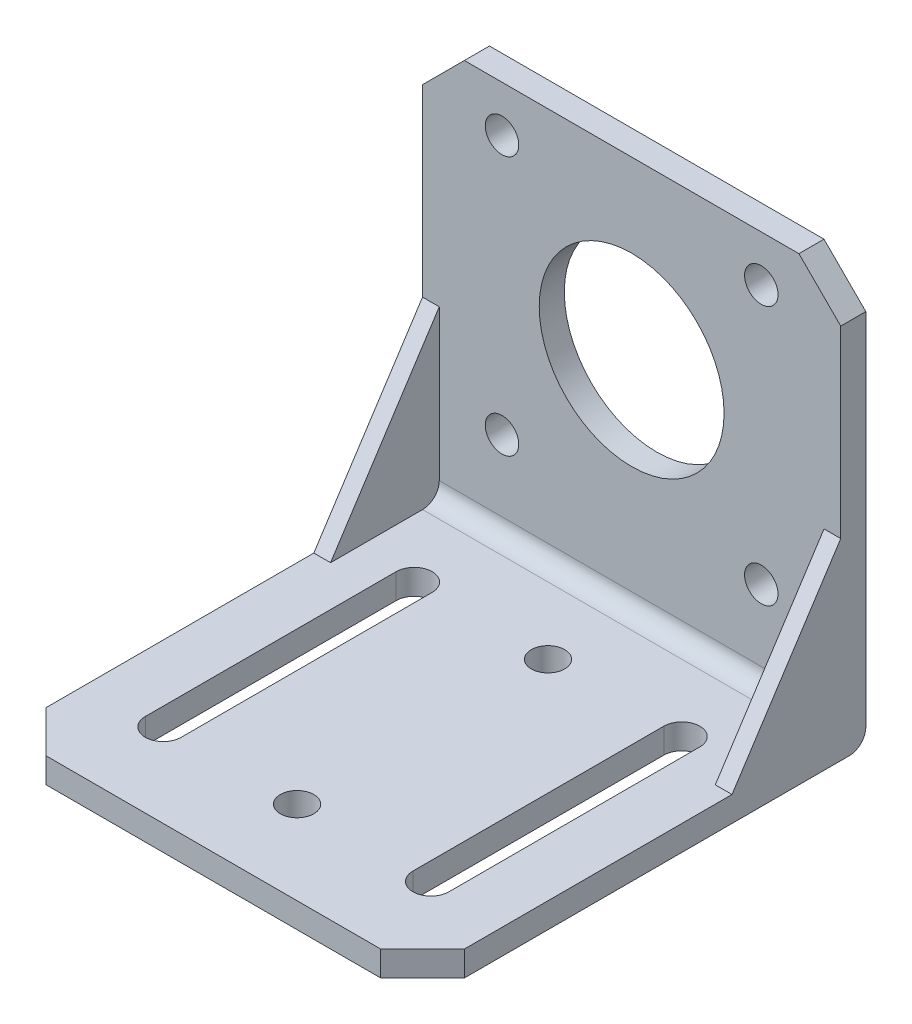
ISO-10303-21;
HEADER;
FILE_DESCRIPTION(('STEP AP214'),'2;1');
FILE_NAME('part.step','',(''),(''),'','','');
FILE_SCHEMA(('AUTOMOTIVE_DESIGN { 1 0 10303 214 1 1 1 1 }'));
ENDSEC;
DATA;
#1=APPLICATION_CONTEXT('core data for automotive mechanical design processes');
#2=APPLICATION_PROTOCOL_DEFINITION('international standard','automotive_design',2000,#1);
#3=PRODUCT_CONTEXT('',#1,'mechanical');
#4=PRODUCT('Part','Part','',(#3));
#5=PRODUCT_RELATED_PRODUCT_CATEGORY('part','',(#4));
#6=PRODUCT_DEFINITION_FORMATION('','',#4);
#7=PRODUCT_DEFINITION_CONTEXT('part definition',#1,'design');
#8=PRODUCT_DEFINITION('design','',#6,#7);
#9=PRODUCT_DEFINITION_SHAPE('','',#8);
#10=(LENGTH_UNIT() NAMED_UNIT(*) SI_UNIT(.MILLI.,.METRE.));
#11=(NAMED_UNIT(*) PLANE_ANGLE_UNIT() SI_UNIT($,.RADIAN.));
#12=(NAMED_UNIT(*) SI_UNIT($,.STERADIAN.) SOLID_ANGLE_UNIT());
#13=UNCERTAINTY_MEASURE_WITH_UNIT(LENGTH_MEASURE(1.E-05),#10,'distance_accuracy_value','');
#14=(GEOMETRIC_REPRESENTATION_CONTEXT(3) GLOBAL_UNCERTAINTY_ASSIGNED_CONTEXT((#13)) GLOBAL_UNIT_ASSIGNED_CONTEXT((#10,
#11,#12)) REPRESENTATION_CONTEXT('',''));
#15=CARTESIAN_POINT('',(0.,0.,0.));
#16=DIRECTION('',(0.,0.,1.));
#17=DIRECTION('',(1.,0.,0.));
#18=AXIS2_PLACEMENT_3D('',#15,#16,#17);
#19=CARTESIAN_POINT('',(25.,50.,0.));
#20=DIRECTION('',(0.,0.,1.));
#21=DIRECTION('',(0.,-1.,0.));
#22=AXIS2_PLACEMENT_3D('',#19,#20,#21);
#23=PLANE('',#22);
#24=CARTESIAN_POINT('',(15.5,13.5,0.));
#25=DIRECTION('',(0.,0.,1.));
#26=DIRECTION('',(1.,0.,0.));
#27=AXIS2_PLACEMENT_3D('',#24,#25,#26);
#28=CIRCLE('',#27,2.);
#29=CARTESIAN_POINT('',(17.5,13.5,0.));
#30=VERTEX_POINT('',#29);
#31=EDGE_CURVE('E296',#30,#30,#28,.T.);
#32=ORIENTED_EDGE('',*,*,#31,.T.);
#33=EDGE_LOOP('',(#32));
#34=FACE_BOUND('',#33,.T.);
#35=CARTESIAN_POINT('',(-15.5,13.5,0.));
#36=DIRECTION('',(0.,0.,1.));
#37=DIRECTION('',(-1.,0.,0.));
#38=AXIS2_PLACEMENT_3D('',#35,#36,#37);
#39=CIRCLE('',#38,2.);
#40=CARTESIAN_POINT('',(-17.5,13.5,0.));
#41=VERTEX_POINT('',#40);
#42=EDGE_CURVE('E290',#41,#41,#39,.T.);
#43=ORIENTED_EDGE('',*,*,#42,.T.);
#44=EDGE_LOOP('',(#43));
#45=FACE_BOUND('',#44,.T.);
#46=CARTESIAN_POINT('',(15.5,44.5,0.));
#47=DIRECTION('',(0.,0.,1.));
#48=DIRECTION('',(-1.,0.,0.));
#49=AXIS2_PLACEMENT_3D('',#46,#47,#48);
#50=CIRCLE('',#49,2.);
#51=CARTESIAN_POINT('',(13.5,44.5,0.));
#52=VERTEX_POINT('',#51);
#53=EDGE_CURVE('E284',#52,#52,#50,.T.);
#54=ORIENTED_EDGE('',*,*,#53,.T.);
#55=EDGE_LOOP('',(#54));
#56=FACE_BOUND('',#55,.T.);
#57=CARTESIAN_POINT('',(-15.5,44.5,0.));
#58=DIRECTION('',(0.,0.,1.));
#59=DIRECTION('',(1.,0.,0.));
#60=AXIS2_PLACEMENT_3D('',#57,#58,#59);
#61=CIRCLE('',#60,2.);
#62=CARTESIAN_POINT('',(-13.5,44.5,0.));
#63=VERTEX_POINT('',#62);
#64=EDGE_CURVE('E277',#63,#63,#61,.T.);
#65=ORIENTED_EDGE('',*,*,#64,.T.);
#66=EDGE_LOOP('',(#65));
#67=FACE_BOUND('',#66,.T.);
#68=CARTESIAN_POINT('',(0.,29.,0.));
#69=DIRECTION('',(0.,0.,1.));
#70=DIRECTION('',(1.,0.,0.));
#71=AXIS2_PLACEMENT_3D('',#68,#69,#70);
#72=CIRCLE('',#71,11.05);
#73=CARTESIAN_POINT('',(11.05,29.,0.));
#74=VERTEX_POINT('',#73);
#75=EDGE_CURVE('E301',#74,#74,#72,.T.);
#76=ORIENTED_EDGE('',*,*,#75,.T.);
#77=EDGE_LOOP('',(#76));
#78=FACE_BOUND('',#77,.T.);
#79=DIRECTION('',(0.,1.,0.));
#80=VECTOR('',#79,1.);
#81=CARTESIAN_POINT('',(-25.,50.,0.));
#82=LINE('',#81,#80);
#83=CARTESIAN_POINT('',(-25.,2.,0.));
#84=VERTEX_POINT('',#83);
#85=CARTESIAN_POINT('',(-25.,45.,0.));
#86=VERTEX_POINT('',#85);
#87=EDGE_CURVE('E339',#84,#86,#82,.T.);
#88=ORIENTED_EDGE('',*,*,#87,.T.);
#89=DIRECTION('',(0.707106781186546,0.707106781186549,0.));
#90=VECTOR('',#89,1.);
#91=CARTESIAN_POINT('',(-20.,50.,0.));
#92=LINE('',#91,#90);
#93=CARTESIAN_POINT('',(-20.,50.,0.));
#94=VERTEX_POINT('',#93);
#95=EDGE_CURVE('E11',#86,#94,#92,.T.);
#96=ORIENTED_EDGE('',*,*,#95,.T.);
#97=DIRECTION('',(-1.,0.,0.));
#98=VECTOR('',#97,1.);
#99=CARTESIAN_POINT('',(25.,50.,0.));
#100=LINE('',#99,#98);
#101=CARTESIAN_POINT('',(20.,50.,0.));
#102=VERTEX_POINT('',#101);
#103=EDGE_CURVE('E368',#102,#94,#100,.T.);
#104=ORIENTED_EDGE('',*,*,#103,.F.);
#105=DIRECTION('',(-0.70710678118655,0.707106781186545,0.));
#106=VECTOR('',#105,1.);
#107=CARTESIAN_POINT('',(25.,45.,0.));
#108=LINE('',#107,#106);
#109=CARTESIAN_POINT('',(25.,45.,0.));
#110=VERTEX_POINT('',#109);
#111=EDGE_CURVE('E51',#102,#110,#108,.F.);
#112=ORIENTED_EDGE('',*,*,#111,.T.);
#113=DIRECTION('',(0.,1.,0.));
#114=VECTOR('',#113,1.);
#115=CARTESIAN_POINT('',(25.,50.,0.));
#116=LINE('',#115,#114);
#117=CARTESIAN_POINT('',(25.,2.,0.));
#118=VERTEX_POINT('',#117);
#119=EDGE_CURVE('E340',#118,#110,#116,.T.);
#120=ORIENTED_EDGE('',*,*,#119,.F.);
#121=DIRECTION('',(-1.,0.,0.));
#122=VECTOR('',#121,1.);
#123=CARTESIAN_POINT('',(25.,2.,0.));
#124=LINE('',#123,#122);
#125=EDGE_CURVE('E380',#118,#84,#124,.T.);
#126=ORIENTED_EDGE('',*,*,#125,.T.);
#127=EDGE_LOOP('',(#88,#96,#104,#112,#120,#126));
#128=FACE_BOUND('',#127,.T.);
#129=ADVANCED_FACE('F42',(#34,#45,#56,#67,#78,#128),#23,.F.);
#130=CARTESIAN_POINT('',(25.,50.,3.));
#131=DIRECTION('',(0.,-1.,0.));
#132=DIRECTION('',(0.,0.,-1.));
#133=AXIS2_PLACEMENT_3D('',#130,#131,#132);
#134=PLANE('',#133);
#135=ORIENTED_EDGE('',*,*,#103,.T.);
#136=DIRECTION('',(0.,0.,1.));
#137=VECTOR('',#136,1.);
#138=CARTESIAN_POINT('',(-20.,50.,3.));
#139=LINE('',#138,#137);
#140=CARTESIAN_POINT('',(-20.,50.,3.));
#141=VERTEX_POINT('',#140);
#142=EDGE_CURVE('E416',#94,#141,#139,.T.);
#143=ORIENTED_EDGE('',*,*,#142,.T.);
#144=DIRECTION('',(-1.,0.,0.));
#145=VECTOR('',#144,1.);
#146=CARTESIAN_POINT('',(25.,50.,3.));
#147=LINE('',#146,#145);
#148=CARTESIAN_POINT('',(20.,50.,3.));
#149=VERTEX_POINT('',#148);
#150=EDGE_CURVE('E365',#149,#141,#147,.T.);
#151=ORIENTED_EDGE('',*,*,#150,.F.);
#152=DIRECTION('',(0.,0.,-1.));
#153=VECTOR('',#152,1.);
#154=CARTESIAN_POINT('',(20.,50.,3.));
#155=LINE('',#154,#153);
#156=EDGE_CURVE('E414',#149,#102,#155,.T.);
#157=ORIENTED_EDGE('',*,*,#156,.T.);
#158=EDGE_LOOP('',(#135,#143,#151,#157));
#159=FACE_BOUND('',#158,.T.);
#160=ADVANCED_FACE('F438',(#159),#134,.F.);
#161=CARTESIAN_POINT('',(25.,2.99999999999999,3.));
#162=DIRECTION('',(0.,0.,-1.));
#163=DIRECTION('',(0.,1.,0.));
#164=AXIS2_PLACEMENT_3D('',#161,#162,#163);
#165=PLANE('',#164);
#166=CARTESIAN_POINT('',(15.5,13.5,3.));
#167=DIRECTION('',(0.,0.,1.));
#168=DIRECTION('',(1.,0.,0.));
#169=AXIS2_PLACEMENT_3D('',#166,#167,#168);
#170=CIRCLE('',#169,2.);
#171=CARTESIAN_POINT('',(17.5,13.5,3.));
#172=VERTEX_POINT('',#171);
#173=EDGE_CURVE('E243',#172,#172,#170,.T.);
#174=ORIENTED_EDGE('',*,*,#173,.F.);
#175=EDGE_LOOP('',(#174));
#176=FACE_BOUND('',#175,.T.);
#177=CARTESIAN_POINT('',(-15.5,13.5,3.));
#178=DIRECTION('',(0.,0.,1.));
#179=DIRECTION('',(-1.,0.,0.));
#180=AXIS2_PLACEMENT_3D('',#177,#178,#179);
#181=CIRCLE('',#180,2.);
#182=CARTESIAN_POINT('',(-17.5,13.5,3.));
#183=VERTEX_POINT('',#182);
#184=EDGE_CURVE('E293',#183,#183,#181,.T.);
#185=ORIENTED_EDGE('',*,*,#184,.F.);
#186=EDGE_LOOP('',(#185));
#187=FACE_BOUND('',#186,.T.);
#188=CARTESIAN_POINT('',(15.5,44.5,3.));
#189=DIRECTION('',(0.,0.,1.));
#190=DIRECTION('',(-1.,0.,0.));
#191=AXIS2_PLACEMENT_3D('',#188,#189,#190);
#192=CIRCLE('',#191,2.);
#193=CARTESIAN_POINT('',(13.5,44.5,3.));
#194=VERTEX_POINT('',#193);
#195=EDGE_CURVE('E287',#194,#194,#192,.T.);
#196=ORIENTED_EDGE('',*,*,#195,.F.);
#197=EDGE_LOOP('',(#196));
#198=FACE_BOUND('',#197,.T.);
#199=CARTESIAN_POINT('',(-15.5,44.5,3.));
#200=DIRECTION('',(0.,0.,1.));
#201=DIRECTION('',(1.,0.,0.));
#202=AXIS2_PLACEMENT_3D('',#199,#200,#201);
#203=CIRCLE('',#202,2.);
#204=CARTESIAN_POINT('',(-13.5,44.5,3.));
#205=VERTEX_POINT('',#204);
#206=EDGE_CURVE('E281',#205,#205,#203,.T.);
#207=ORIENTED_EDGE('',*,*,#206,.F.);
#208=EDGE_LOOP('',(#207));
#209=FACE_BOUND('',#208,.T.);
#210=CARTESIAN_POINT('',(0.,29.,3.));
#211=DIRECTION('',(0.,0.,1.));
#212=DIRECTION('',(1.,0.,0.));
#213=AXIS2_PLACEMENT_3D('',#210,#211,#212);
#214=CIRCLE('',#213,11.05);
#215=CARTESIAN_POINT('',(11.05,29.,3.));
#216=VERTEX_POINT('',#215);
#217=EDGE_CURVE('E280',#216,#216,#214,.T.);
#218=ORIENTED_EDGE('',*,*,#217,.F.);
#219=EDGE_LOOP('',(#218));
#220=FACE_BOUND('',#219,.T.);
#221=ORIENTED_EDGE('',*,*,#150,.T.);
#222=DIRECTION('',(-0.707106781186546,-0.707106781186549,0.));
#223=VECTOR('',#222,1.);
#224=CARTESIAN_POINT('',(-20.,50.,3.));
#225=LINE('',#224,#223);
#226=CARTESIAN_POINT('',(-25.,45.,3.));
#227=VERTEX_POINT('',#226);
#228=EDGE_CURVE('E421',#141,#227,#225,.T.);
#229=ORIENTED_EDGE('',*,*,#228,.T.);
#230=DIRECTION('',(0.,-1.,0.));
#231=VECTOR('',#230,1.);
#232=CARTESIAN_POINT('',(-25.,2.99999999999999,3.));
#233=LINE('',#232,#231);
#234=CARTESIAN_POINT('',(-25.,23.,3.));
#235=VERTEX_POINT('',#234);
#236=EDGE_CURVE('E354',#227,#235,#233,.T.);
#237=ORIENTED_EDGE('',*,*,#236,.T.);
#238=DIRECTION('',(1.,0.,0.));
#239=VECTOR('',#238,1.);
#240=CARTESIAN_POINT('',(25.,23.,3.));
#241=LINE('',#240,#239);
#242=CARTESIAN_POINT('',(-23.,23.,3.));
#243=VERTEX_POINT('',#242);
#244=EDGE_CURVE('E314',#235,#243,#241,.T.);
#245=ORIENTED_EDGE('',*,*,#244,.T.);
#246=DIRECTION('',(0.,1.,0.));
#247=VECTOR('',#246,1.);
#248=CARTESIAN_POINT('',(-23.,2.99999999999999,3.));
#249=LINE('',#248,#247);
#250=CARTESIAN_POINT('',(-23.,4.99999999999999,3.));
#251=VERTEX_POINT('',#250);
#252=EDGE_CURVE('E320',#251,#243,#249,.T.);
#253=ORIENTED_EDGE('',*,*,#252,.F.);
#254=DIRECTION('',(-1.,0.,0.));
#255=VECTOR('',#254,1.);
#256=CARTESIAN_POINT('',(23.,4.99999999999999,3.));
#257=LINE('',#256,#255);
#258=CARTESIAN_POINT('',(23.,4.99999999999999,3.));
#259=VERTEX_POINT('',#258);
#260=EDGE_CURVE('E376',#251,#259,#257,.F.);
#261=ORIENTED_EDGE('',*,*,#260,.T.);
#262=DIRECTION('',(0.,-1.,0.));
#263=VECTOR('',#262,1.);
#264=CARTESIAN_POINT('',(23.,2.99999999999999,3.));
#265=LINE('',#264,#263);
#266=CARTESIAN_POINT('',(23.,23.,3.));
#267=VERTEX_POINT('',#266);
#268=EDGE_CURVE('E336',#267,#259,#265,.T.);
#269=ORIENTED_EDGE('',*,*,#268,.F.);
#270=DIRECTION('',(-1.,0.,0.));
#271=VECTOR('',#270,1.);
#272=CARTESIAN_POINT('',(25.,23.,3.));
#273=LINE('',#272,#271);
#274=CARTESIAN_POINT('',(25.,23.,3.));
#275=VERTEX_POINT('',#274);
#276=EDGE_CURVE('E331',#267,#275,#273,.F.);
#277=ORIENTED_EDGE('',*,*,#276,.T.);
#278=DIRECTION('',(0.,-1.,0.));
#279=VECTOR('',#278,1.);
#280=CARTESIAN_POINT('',(25.,2.99999999999999,3.));
#281=LINE('',#280,#279);
#282=CARTESIAN_POINT('',(25.,45.,3.));
#283=VERTEX_POINT('',#282);
#284=EDGE_CURVE('E343',#283,#275,#281,.T.);
#285=ORIENTED_EDGE('',*,*,#284,.F.);
#286=DIRECTION('',(0.70710678118655,-0.707106781186545,0.));
#287=VECTOR('',#286,1.);
#288=CARTESIAN_POINT('',(25.,45.,3.));
#289=LINE('',#288,#287);
#290=EDGE_CURVE('E419',#283,#149,#289,.F.);
#291=ORIENTED_EDGE('',*,*,#290,.T.);
#292=EDGE_LOOP('',(#221,#229,#237,#245,#253,#261,#269,#277,#285,#291));
#293=FACE_BOUND('',#292,.T.);
#294=ADVANCED_FACE('F436',(#176,#187,#198,#209,#220,#293),#165,.F.);
#295=CARTESIAN_POINT('',(25.,2.99999999999999,53.));
#296=DIRECTION('',(0.,-1.,0.));
#297=DIRECTION('',(0.,0.,-1.));
#298=AXIS2_PLACEMENT_3D('',#295,#296,#297);
#299=PLANE('',#298);
#300=CARTESIAN_POINT('',(0.,2.99999999999999,13.));
#301=DIRECTION('',(0.,1.,0.));
#302=DIRECTION('',(0.,0.,1.));
#303=AXIS2_PLACEMENT_3D('',#300,#301,#302);
#304=CIRCLE('',#303,2.);
#305=CARTESIAN_POINT('',(0.,2.99999999999999,15.));
#306=VERTEX_POINT('',#305);
#307=EDGE_CURVE('E594',#306,#306,#304,.T.);
#308=ORIENTED_EDGE('',*,*,#307,.F.);
#309=EDGE_LOOP('',(#308));
#310=FACE_BOUND('',#309,.T.);
#311=CARTESIAN_POINT('',(0.,2.99999999999999,43.));
#312=DIRECTION('',(0.,1.,0.));
#313=DIRECTION('',(0.,0.,-1.));
#314=AXIS2_PLACEMENT_3D('',#311,#312,#313);
#315=CIRCLE('',#314,2.);
#316=CARTESIAN_POINT('',(0.,2.99999999999999,41.));
#317=VERTEX_POINT('',#316);
#318=EDGE_CURVE('E230',#317,#317,#315,.T.);
#319=ORIENTED_EDGE('',*,*,#318,.F.);
#320=EDGE_LOOP('',(#319));
#321=FACE_BOUND('',#320,.T.);
#322=DIRECTION('',(0.,0.,1.));
#323=VECTOR('',#322,1.);
#324=CARTESIAN_POINT('',(-18.15,2.99999999999999,13.));
#325=LINE('',#324,#323);
#326=CARTESIAN_POINT('',(-18.15,2.99999999999999,13.));
#327=VERTEX_POINT('',#326);
#328=CARTESIAN_POINT('',(-18.15,2.99999999999999,43.));
#329=VERTEX_POINT('',#328);
#330=EDGE_CURVE('E236',#327,#329,#325,.T.);
#331=ORIENTED_EDGE('',*,*,#330,.F.);
#332=CARTESIAN_POINT('',(-16.,2.99999999999999,13.));
#333=DIRECTION('',(0.,1.,0.));
#334=DIRECTION('',(0.,0.,1.));
#335=AXIS2_PLACEMENT_3D('',#332,#333,#334);
#336=CIRCLE('',#335,2.15);
#337=CARTESIAN_POINT('',(-13.85,2.99999999999999,13.));
#338=VERTEX_POINT('',#337);
#339=EDGE_CURVE('E58',#338,#327,#336,.T.);
#340=ORIENTED_EDGE('',*,*,#339,.F.);
#341=DIRECTION('',(0.,0.,-1.));
#342=VECTOR('',#341,1.);
#343=CARTESIAN_POINT('',(-13.85,2.99999999999999,13.));
#344=LINE('',#343,#342);
#345=CARTESIAN_POINT('',(-13.85,2.99999999999999,43.));
#346=VERTEX_POINT('',#345);
#347=EDGE_CURVE('E224',#346,#338,#344,.T.);
#348=ORIENTED_EDGE('',*,*,#347,.F.);
#349=CARTESIAN_POINT('',(-16.,2.99999999999999,43.));
#350=DIRECTION('',(0.,1.,0.));
#351=DIRECTION('',(0.,0.,1.));
#352=AXIS2_PLACEMENT_3D('',#349,#350,#351);
#353=CIRCLE('',#352,2.15);
#354=EDGE_CURVE('E227',#329,#346,#353,.T.);
#355=ORIENTED_EDGE('',*,*,#354,.F.);
#356=EDGE_LOOP('',(#331,#340,#348,#355));
#357=FACE_BOUND('',#356,.T.);
#358=DIRECTION('',(0.,0.,1.));
#359=VECTOR('',#358,1.);
#360=CARTESIAN_POINT('',(13.85,2.99999999999999,13.));
#361=LINE('',#360,#359);
#362=CARTESIAN_POINT('',(13.85,2.99999999999999,13.));
#363=VERTEX_POINT('',#362);
#364=CARTESIAN_POINT('',(13.85,2.99999999999999,43.));
#365=VERTEX_POINT('',#364);
#366=EDGE_CURVE('E262',#363,#365,#361,.T.);
#367=ORIENTED_EDGE('',*,*,#366,.F.);
#368=CARTESIAN_POINT('',(16.,2.99999999999999,13.));
#369=DIRECTION('',(0.,1.,0.));
#370=DIRECTION('',(0.,0.,-1.));
#371=AXIS2_PLACEMENT_3D('',#368,#369,#370);
#372=CIRCLE('',#371,2.15);
#373=CARTESIAN_POINT('',(18.15,2.99999999999999,13.));
#374=VERTEX_POINT('',#373);
#375=EDGE_CURVE('E66',#374,#363,#372,.T.);
#376=ORIENTED_EDGE('',*,*,#375,.F.);
#377=DIRECTION('',(0.,0.,-1.));
#378=VECTOR('',#377,1.);
#379=CARTESIAN_POINT('',(18.15,2.99999999999999,13.));
#380=LINE('',#379,#378);
#381=CARTESIAN_POINT('',(18.15,2.99999999999999,43.));
#382=VERTEX_POINT('',#381);
#383=EDGE_CURVE('E251',#382,#374,#380,.T.);
#384=ORIENTED_EDGE('',*,*,#383,.F.);
#385=CARTESIAN_POINT('',(16.,2.99999999999999,43.));
#386=DIRECTION('',(0.,1.,0.));
#387=DIRECTION('',(0.,0.,-1.));
#388=AXIS2_PLACEMENT_3D('',#385,#386,#387);
#389=CIRCLE('',#388,2.15);
#390=EDGE_CURVE('E266',#365,#382,#389,.T.);
#391=ORIENTED_EDGE('',*,*,#390,.F.);
#392=EDGE_LOOP('',(#367,#376,#384,#391));
#393=FACE_BOUND('',#392,.T.);
#394=DIRECTION('',(-1.,0.,0.));
#395=VECTOR('',#394,1.);
#396=CARTESIAN_POINT('',(25.,2.99999999999999,53.));
#397=LINE('',#396,#395);
#398=CARTESIAN_POINT('',(20.,2.99999999999999,53.));
#399=VERTEX_POINT('',#398);
#400=CARTESIAN_POINT('',(-20.,2.99999999999999,53.));
#401=VERTEX_POINT('',#400);
#402=EDGE_CURVE('E362',#399,#401,#397,.T.);
#403=ORIENTED_EDGE('',*,*,#402,.F.);
#404=DIRECTION('',(-0.70710678118655,0.,0.707106781186545));
#405=VECTOR('',#404,1.);
#406=CARTESIAN_POINT('',(25.,2.99999999999999,48.));
#407=LINE('',#406,#405);
#408=CARTESIAN_POINT('',(25.,2.99999999999999,48.));
#409=VERTEX_POINT('',#408);
#410=EDGE_CURVE('E408',#399,#409,#407,.F.);
#411=ORIENTED_EDGE('',*,*,#410,.T.);
#412=DIRECTION('',(0.,0.,1.));
#413=VECTOR('',#412,1.);
#414=CARTESIAN_POINT('',(25.,2.99999999999999,53.));
#415=LINE('',#414,#413);
#416=CARTESIAN_POINT('',(25.,2.99999999999999,16.));
#417=VERTEX_POINT('',#416);
#418=EDGE_CURVE('E346',#417,#409,#415,.T.);
#419=ORIENTED_EDGE('',*,*,#418,.F.);
#420=DIRECTION('',(1.,0.,0.));
#421=VECTOR('',#420,1.);
#422=CARTESIAN_POINT('',(25.,2.99999999999999,16.));
#423=LINE('',#422,#421);
#424=CARTESIAN_POINT('',(23.,2.99999999999999,16.));
#425=VERTEX_POINT('',#424);
#426=EDGE_CURVE('E326',#417,#425,#423,.F.);
#427=ORIENTED_EDGE('',*,*,#426,.T.);
#428=DIRECTION('',(0.,0.,1.));
#429=VECTOR('',#428,1.);
#430=CARTESIAN_POINT('',(23.,2.99999999999999,53.));
#431=LINE('',#430,#429);
#432=CARTESIAN_POINT('',(23.,2.99999999999999,5.));
#433=VERTEX_POINT('',#432);
#434=EDGE_CURVE('E334',#433,#425,#431,.T.);
#435=ORIENTED_EDGE('',*,*,#434,.F.);
#436=DIRECTION('',(-1.,0.,0.));
#437=VECTOR('',#436,1.);
#438=CARTESIAN_POINT('',(-23.,2.99999999999999,5.));
#439=LINE('',#438,#437);
#440=CARTESIAN_POINT('',(-23.,2.99999999999999,5.));
#441=VERTEX_POINT('',#440);
#442=EDGE_CURVE('E371',#433,#441,#439,.T.);
#443=ORIENTED_EDGE('',*,*,#442,.T.);
#444=DIRECTION('',(0.,0.,-1.));
#445=VECTOR('',#444,1.);
#446=CARTESIAN_POINT('',(-23.,2.99999999999999,53.));
#447=LINE('',#446,#445);
#448=CARTESIAN_POINT('',(-23.,2.99999999999999,16.));
#449=VERTEX_POINT('',#448);
#450=EDGE_CURVE('E317',#449,#441,#447,.T.);
#451=ORIENTED_EDGE('',*,*,#450,.F.);
#452=DIRECTION('',(-1.,0.,0.));
#453=VECTOR('',#452,1.);
#454=CARTESIAN_POINT('',(25.,2.99999999999999,16.));
#455=LINE('',#454,#453);
#456=CARTESIAN_POINT('',(-25.,2.99999999999999,16.));
#457=VERTEX_POINT('',#456);
#458=EDGE_CURVE('E310',#449,#457,#455,.T.);
#459=ORIENTED_EDGE('',*,*,#458,.T.);
#460=DIRECTION('',(0.,0.,1.));
#461=VECTOR('',#460,1.);
#462=CARTESIAN_POINT('',(-25.,2.99999999999999,53.));
#463=LINE('',#462,#461);
#464=CARTESIAN_POINT('',(-25.,2.99999999999999,48.));
#465=VERTEX_POINT('',#464);
#466=EDGE_CURVE('E356',#457,#465,#463,.T.);
#467=ORIENTED_EDGE('',*,*,#466,.T.);
#468=DIRECTION('',(0.707106781186546,0.,0.707106781186549));
#469=VECTOR('',#468,1.);
#470=CARTESIAN_POINT('',(-20.,2.99999999999999,53.));
#471=LINE('',#470,#469);
#472=EDGE_CURVE('E406',#465,#401,#471,.T.);
#473=ORIENTED_EDGE('',*,*,#472,.T.);
#474=EDGE_LOOP('',(#403,#411,#419,#427,#435,#443,#451,#459,#467,#473));
#475=FACE_BOUND('',#474,.T.);
#476=ADVANCED_FACE('F470',(#310,#321,#357,#393,#475),#299,.F.);
#477=CARTESIAN_POINT('',(25.,0.,53.));
#478=DIRECTION('',(0.,0.,-1.));
#479=DIRECTION('',(-1.,0.,0.));
#480=AXIS2_PLACEMENT_3D('',#477,#478,#479);
#481=PLANE('',#480);
#482=DIRECTION('',(-1.,0.,0.));
#483=VECTOR('',#482,1.);
#484=CARTESIAN_POINT('',(25.,0.,53.));
#485=LINE('',#484,#483);
#486=CARTESIAN_POINT('',(20.,0.,53.));
#487=VERTEX_POINT('',#486);
#488=CARTESIAN_POINT('',(-20.,0.,53.));
#489=VERTEX_POINT('',#488);
#490=EDGE_CURVE('E351',#487,#489,#485,.T.);
#491=ORIENTED_EDGE('',*,*,#490,.F.);
#492=DIRECTION('',(0.,1.,0.));
#493=VECTOR('',#492,1.);
#494=CARTESIAN_POINT('',(20.,0.,53.));
#495=LINE('',#494,#493);
#496=EDGE_CURVE('E404',#487,#399,#495,.T.);
#497=ORIENTED_EDGE('',*,*,#496,.T.);
#498=ORIENTED_EDGE('',*,*,#402,.T.);
#499=DIRECTION('',(0.,-1.,0.));
#500=VECTOR('',#499,1.);
#501=CARTESIAN_POINT('',(-20.,0.,53.));
#502=LINE('',#501,#500);
#503=EDGE_CURVE('E401',#401,#489,#502,.T.);
#504=ORIENTED_EDGE('',*,*,#503,.T.);
#505=EDGE_LOOP('',(#491,#497,#498,#504));
#506=FACE_BOUND('',#505,.T.);
#507=ADVANCED_FACE('F484',(#506),#481,.F.);
#508=CARTESIAN_POINT('',(25.,0.,0.));
#509=DIRECTION('',(0.,1.,0.));
#510=DIRECTION('',(0.,0.,1.));
#511=AXIS2_PLACEMENT_3D('',#508,#509,#510);
#512=PLANE('',#511);
#513=CARTESIAN_POINT('',(0.,0.,13.));
#514=DIRECTION('',(0.,1.,0.));
#515=DIRECTION('',(0.,0.,1.));
#516=AXIS2_PLACEMENT_3D('',#513,#514,#515);
#517=CIRCLE('',#516,2.);
#518=CARTESIAN_POINT('',(0.,0.,15.));
#519=VERTEX_POINT('',#518);
#520=EDGE_CURVE('E263',#519,#519,#517,.T.);
#521=ORIENTED_EDGE('',*,*,#520,.T.);
#522=EDGE_LOOP('',(#521));
#523=FACE_BOUND('',#522,.T.);
#524=CARTESIAN_POINT('',(0.,0.,43.));
#525=DIRECTION('',(0.,1.,0.));
#526=DIRECTION('',(0.,0.,-1.));
#527=AXIS2_PLACEMENT_3D('',#524,#525,#526);
#528=CIRCLE('',#527,2.);
#529=CARTESIAN_POINT('',(0.,0.,41.));
#530=VERTEX_POINT('',#529);
#531=EDGE_CURVE('E595',#530,#530,#528,.T.);
#532=ORIENTED_EDGE('',*,*,#531,.T.);
#533=EDGE_LOOP('',(#532));
#534=FACE_BOUND('',#533,.T.);
#535=DIRECTION('',(0.,0.,-1.));
#536=VECTOR('',#535,1.);
#537=CARTESIAN_POINT('',(-13.85,0.,13.));
#538=LINE('',#537,#536);
#539=CARTESIAN_POINT('',(-13.85,0.,43.));
#540=VERTEX_POINT('',#539);
#541=CARTESIAN_POINT('',(-13.85,0.,13.));
#542=VERTEX_POINT('',#541);
#543=EDGE_CURVE('E211',#540,#542,#538,.T.);
#544=ORIENTED_EDGE('',*,*,#543,.T.);
#545=CARTESIAN_POINT('',(-16.,0.,13.));
#546=DIRECTION('',(0.,1.,0.));
#547=DIRECTION('',(0.,0.,1.));
#548=AXIS2_PLACEMENT_3D('',#545,#546,#547);
#549=CIRCLE('',#548,2.15);
#550=CARTESIAN_POINT('',(-18.15,0.,13.));
#551=VERTEX_POINT('',#550);
#552=EDGE_CURVE('E205',#542,#551,#549,.T.);
#553=ORIENTED_EDGE('',*,*,#552,.T.);
#554=DIRECTION('',(0.,0.,1.));
#555=VECTOR('',#554,1.);
#556=CARTESIAN_POINT('',(-18.15,0.,13.));
#557=LINE('',#556,#555);
#558=CARTESIAN_POINT('',(-18.15,0.,43.));
#559=VERTEX_POINT('',#558);
#560=EDGE_CURVE('E215',#551,#559,#557,.T.);
#561=ORIENTED_EDGE('',*,*,#560,.T.);
#562=CARTESIAN_POINT('',(-16.,0.,43.));
#563=DIRECTION('',(0.,1.,0.));
#564=DIRECTION('',(0.,0.,1.));
#565=AXIS2_PLACEMENT_3D('',#562,#563,#564);
#566=CIRCLE('',#565,2.15);
#567=EDGE_CURVE('E219',#559,#540,#566,.T.);
#568=ORIENTED_EDGE('',*,*,#567,.T.);
#569=EDGE_LOOP('',(#544,#553,#561,#568));
#570=FACE_BOUND('',#569,.T.);
#571=DIRECTION('',(0.,0.,-1.));
#572=VECTOR('',#571,1.);
#573=CARTESIAN_POINT('',(18.15,0.,13.));
#574=LINE('',#573,#572);
#575=CARTESIAN_POINT('',(18.15,0.,43.));
#576=VERTEX_POINT('',#575);
#577=CARTESIAN_POINT('',(18.15,0.,13.));
#578=VERTEX_POINT('',#577);
#579=EDGE_CURVE('E257',#576,#578,#574,.T.);
#580=ORIENTED_EDGE('',*,*,#579,.T.);
#581=CARTESIAN_POINT('',(16.,0.,13.));
#582=DIRECTION('',(0.,1.,0.));
#583=DIRECTION('',(0.,0.,-1.));
#584=AXIS2_PLACEMENT_3D('',#581,#582,#583);
#585=CIRCLE('',#584,2.15);
#586=CARTESIAN_POINT('',(13.85,0.,13.));
#587=VERTEX_POINT('',#586);
#588=EDGE_CURVE('E247',#578,#587,#585,.T.);
#589=ORIENTED_EDGE('',*,*,#588,.T.);
#590=DIRECTION('',(0.,0.,1.));
#591=VECTOR('',#590,1.);
#592=CARTESIAN_POINT('',(13.85,0.,13.));
#593=LINE('',#592,#591);
#594=CARTESIAN_POINT('',(13.85,0.,43.));
#595=VERTEX_POINT('',#594);
#596=EDGE_CURVE('E250',#587,#595,#593,.T.);
#597=ORIENTED_EDGE('',*,*,#596,.T.);
#598=CARTESIAN_POINT('',(16.,0.,43.));
#599=DIRECTION('',(0.,1.,0.));
#600=DIRECTION('',(0.,0.,-1.));
#601=AXIS2_PLACEMENT_3D('',#598,#599,#600);
#602=CIRCLE('',#601,2.15);
#603=EDGE_CURVE('E254',#595,#576,#602,.T.);
#604=ORIENTED_EDGE('',*,*,#603,.T.);
#605=EDGE_LOOP('',(#580,#589,#597,#604));
#606=FACE_BOUND('',#605,.T.);
#607=DIRECTION('',(0.,0.,-1.));
#608=VECTOR('',#607,1.);
#609=CARTESIAN_POINT('',(25.,0.,0.));
#610=LINE('',#609,#608);
#611=CARTESIAN_POINT('',(25.,0.,48.));
#612=VERTEX_POINT('',#611);
#613=CARTESIAN_POINT('',(25.,0.,2.));
#614=VERTEX_POINT('',#613);
#615=EDGE_CURVE('E349',#612,#614,#610,.T.);
#616=ORIENTED_EDGE('',*,*,#615,.F.);
#617=DIRECTION('',(0.70710678118655,0.,-0.707106781186545));
#618=VECTOR('',#617,1.);
#619=CARTESIAN_POINT('',(25.,0.,48.));
#620=LINE('',#619,#618);
#621=EDGE_CURVE('E399',#612,#487,#620,.F.);
#622=ORIENTED_EDGE('',*,*,#621,.T.);
#623=ORIENTED_EDGE('',*,*,#490,.T.);
#624=DIRECTION('',(-0.707106781186546,0.,-0.707106781186549));
#625=VECTOR('',#624,1.);
#626=CARTESIAN_POINT('',(-20.,0.,53.));
#627=LINE('',#626,#625);
#628=CARTESIAN_POINT('',(-25.,0.,48.));
#629=VERTEX_POINT('',#628);
#630=EDGE_CURVE('E397',#489,#629,#627,.T.);
#631=ORIENTED_EDGE('',*,*,#630,.T.);
#632=DIRECTION('',(0.,0.,-1.));
#633=VECTOR('',#632,1.);
#634=CARTESIAN_POINT('',(-25.,0.,0.));
#635=LINE('',#634,#633);
#636=CARTESIAN_POINT('',(-25.,0.,2.));
#637=VERTEX_POINT('',#636);
#638=EDGE_CURVE('E344',#629,#637,#635,.T.);
#639=ORIENTED_EDGE('',*,*,#638,.T.);
#640=DIRECTION('',(-1.,0.,0.));
#641=VECTOR('',#640,1.);
#642=CARTESIAN_POINT('',(25.,0.,2.));
#643=LINE('',#642,#641);
#644=EDGE_CURVE('E386',#637,#614,#643,.F.);
#645=ORIENTED_EDGE('',*,*,#644,.T.);
#646=EDGE_LOOP('',(#616,#622,#623,#631,#639,#645));
#647=FACE_BOUND('',#646,.T.);
#648=ADVANCED_FACE('F221',(#523,#534,#570,#606,#647),#512,.F.);
#649=CARTESIAN_POINT('',(25.,0.,0.));
#650=DIRECTION('',(-1.,0.,0.));
#651=DIRECTION('',(0.,0.,1.));
#652=AXIS2_PLACEMENT_3D('',#649,#650,#651);
#653=PLANE('',#652);
#654=ORIENTED_EDGE('',*,*,#418,.T.);
#655=DIRECTION('',(0.,-1.,0.));
#656=VECTOR('',#655,1.);
#657=CARTESIAN_POINT('',(25.,0.,48.));
#658=LINE('',#657,#656);
#659=EDGE_CURVE('E394',#409,#612,#658,.T.);
#660=ORIENTED_EDGE('',*,*,#659,.T.);
#661=ORIENTED_EDGE('',*,*,#615,.T.);
#662=CARTESIAN_POINT('',(25.,2.,2.));
#663=DIRECTION('',(-1.,0.,0.));
#664=DIRECTION('',(0.,0.,1.));
#665=AXIS2_PLACEMENT_3D('',#662,#663,#664);
#666=CIRCLE('',#665,2.);
#667=EDGE_CURVE('E389',#614,#118,#666,.F.);
#668=ORIENTED_EDGE('',*,*,#667,.T.);
#669=ORIENTED_EDGE('',*,*,#119,.T.);
#670=DIRECTION('',(0.,0.,1.));
#671=VECTOR('',#670,1.);
#672=CARTESIAN_POINT('',(25.,45.,0.));
#673=LINE('',#672,#671);
#674=EDGE_CURVE('E391',#110,#283,#673,.T.);
#675=ORIENTED_EDGE('',*,*,#674,.T.);
#676=ORIENTED_EDGE('',*,*,#284,.T.);
#677=DIRECTION('',(0.,0.838443616300637,-0.544988350595414));
#678=VECTOR('',#677,1.);
#679=CARTESIAN_POINT('',(25.,3.,16.));
#680=LINE('',#679,#678);
#681=EDGE_CURVE('E323',#417,#275,#680,.T.);
#682=ORIENTED_EDGE('',*,*,#681,.F.);
#683=EDGE_LOOP('',(#654,#660,#661,#668,#669,#675,#676,#682));
#684=FACE_BOUND('',#683,.T.);
#685=ADVANCED_FACE('F431',(#684),#653,.F.);
#686=CARTESIAN_POINT('',(-25.,0.,0.));
#687=DIRECTION('',(-1.,0.,0.));
#688=DIRECTION('',(0.,0.,1.));
#689=AXIS2_PLACEMENT_3D('',#686,#687,#688);
#690=PLANE('',#689);
#691=ORIENTED_EDGE('',*,*,#638,.F.);
#692=DIRECTION('',(0.,1.,0.));
#693=VECTOR('',#692,1.);
#694=CARTESIAN_POINT('',(-25.,2.99999999999999,48.));
#695=LINE('',#694,#693);
#696=EDGE_CURVE('E412',#629,#465,#695,.T.);
#697=ORIENTED_EDGE('',*,*,#696,.T.);
#698=ORIENTED_EDGE('',*,*,#466,.F.);
#699=DIRECTION('',(0.,0.838443616300637,-0.544988350595414));
#700=VECTOR('',#699,1.);
#701=CARTESIAN_POINT('',(-25.,3.,16.));
#702=LINE('',#701,#700);
#703=EDGE_CURVE('E307',#457,#235,#702,.T.);
#704=ORIENTED_EDGE('',*,*,#703,.T.);
#705=ORIENTED_EDGE('',*,*,#236,.F.);
#706=DIRECTION('',(0.,0.,-1.));
#707=VECTOR('',#706,1.);
#708=CARTESIAN_POINT('',(-25.,45.,0.));
#709=LINE('',#708,#707);
#710=EDGE_CURVE('E410',#227,#86,#709,.T.);
#711=ORIENTED_EDGE('',*,*,#710,.T.);
#712=ORIENTED_EDGE('',*,*,#87,.F.);
#713=CARTESIAN_POINT('',(-25.,2.,2.));
#714=DIRECTION('',(-1.,0.,0.));
#715=DIRECTION('',(0.,0.,1.));
#716=AXIS2_PLACEMENT_3D('',#713,#714,#715);
#717=CIRCLE('',#716,2.);
#718=EDGE_CURVE('E383',#84,#637,#717,.T.);
#719=ORIENTED_EDGE('',*,*,#718,.T.);
#720=EDGE_LOOP('',(#691,#697,#698,#704,#705,#711,#712,#719));
#721=FACE_BOUND('',#720,.T.);
#722=ADVANCED_FACE('F448',(#721),#690,.T.);
#723=CARTESIAN_POINT('',(23.,25.,26.5));
#724=DIRECTION('',(1.,0.,0.));
#725=DIRECTION('',(0.,0.,-1.));
#726=AXIS2_PLACEMENT_3D('',#723,#724,#725);
#727=PLANE('',#726);
#728=ORIENTED_EDGE('',*,*,#268,.T.);
#729=CARTESIAN_POINT('',(23.,4.99999999999999,5.));
#730=DIRECTION('',(1.,0.,0.));
#731=DIRECTION('',(0.,0.,-1.));
#732=AXIS2_PLACEMENT_3D('',#729,#730,#731);
#733=CIRCLE('',#732,2.);
#734=EDGE_CURVE('E378',#259,#433,#733,.F.);
#735=ORIENTED_EDGE('',*,*,#734,.T.);
#736=ORIENTED_EDGE('',*,*,#434,.T.);
#737=DIRECTION('',(0.,0.838443616300637,-0.544988350595414));
#738=VECTOR('',#737,1.);
#739=CARTESIAN_POINT('',(23.,3.,16.));
#740=LINE('',#739,#738);
#741=EDGE_CURVE('E322',#425,#267,#740,.T.);
#742=ORIENTED_EDGE('',*,*,#741,.T.);
#743=EDGE_LOOP('',(#728,#735,#736,#742));
#744=FACE_BOUND('',#743,.T.);
#745=ADVANCED_FACE('F466',(#744),#727,.F.);
#746=CARTESIAN_POINT('',(25.,3.,16.));
#747=DIRECTION('',(0.,-0.544988350595414,-0.838443616300637));
#748=DIRECTION('',(0.,0.838443616300637,-0.544988350595414));
#749=AXIS2_PLACEMENT_3D('',#746,#747,#748);
#750=PLANE('',#749);
#751=ORIENTED_EDGE('',*,*,#276,.F.);
#752=ORIENTED_EDGE('',*,*,#741,.F.);
#753=ORIENTED_EDGE('',*,*,#426,.F.);
#754=ORIENTED_EDGE('',*,*,#681,.T.);
#755=EDGE_LOOP('',(#751,#752,#753,#754));
#756=FACE_BOUND('',#755,.T.);
#757=ADVANCED_FACE('F474',(#756),#750,.F.);
#758=CARTESIAN_POINT('',(-23.,25.,26.5));
#759=DIRECTION('',(-1.,0.,0.));
#760=DIRECTION('',(0.,0.,1.));
#761=AXIS2_PLACEMENT_3D('',#758,#759,#760);
#762=PLANE('',#761);
#763=ORIENTED_EDGE('',*,*,#450,.T.);
#764=CARTESIAN_POINT('',(-23.,4.99999999999999,5.));
#765=DIRECTION('',(-1.,0.,0.));
#766=DIRECTION('',(0.,0.,1.));
#767=AXIS2_PLACEMENT_3D('',#764,#765,#766);
#768=CIRCLE('',#767,2.);
#769=EDGE_CURVE('E374',#441,#251,#768,.F.);
#770=ORIENTED_EDGE('',*,*,#769,.T.);
#771=ORIENTED_EDGE('',*,*,#252,.T.);
#772=DIRECTION('',(0.,0.838443616300637,-0.544988350595414));
#773=VECTOR('',#772,1.);
#774=CARTESIAN_POINT('',(-23.,3.,16.));
#775=LINE('',#774,#773);
#776=EDGE_CURVE('E304',#449,#243,#775,.T.);
#777=ORIENTED_EDGE('',*,*,#776,.F.);
#778=EDGE_LOOP('',(#763,#770,#771,#777));
#779=FACE_BOUND('',#778,.T.);
#780=ADVANCED_FACE('F531',(#779),#762,.F.);
#781=CARTESIAN_POINT('',(-25.,3.,16.));
#782=DIRECTION('',(0.,0.544988350595414,0.838443616300637));
#783=DIRECTION('',(0.,0.838443616300637,-0.544988350595414));
#784=AXIS2_PLACEMENT_3D('',#781,#782,#783);
#785=PLANE('',#784);
#786=ORIENTED_EDGE('',*,*,#244,.F.);
#787=ORIENTED_EDGE('',*,*,#703,.F.);
#788=ORIENTED_EDGE('',*,*,#458,.F.);
#789=ORIENTED_EDGE('',*,*,#776,.T.);
#790=EDGE_LOOP('',(#786,#787,#788,#789));
#791=FACE_BOUND('',#790,.T.);
#792=ADVANCED_FACE('F454',(#791),#785,.T.);
#793=CARTESIAN_POINT('',(25.,4.99999999999999,5.));
#794=DIRECTION('',(1.,0.,0.));
#795=DIRECTION('',(0.,0.,-1.));
#796=AXIS2_PLACEMENT_3D('',#793,#794,#795);
#797=CYLINDRICAL_SURFACE('',#796,2.);
#798=ORIENTED_EDGE('',*,*,#734,.F.);
#799=ORIENTED_EDGE('',*,*,#260,.F.);
#800=ORIENTED_EDGE('',*,*,#769,.F.);
#801=ORIENTED_EDGE('',*,*,#442,.F.);
#802=EDGE_LOOP('',(#798,#799,#800,#801));
#803=FACE_BOUND('',#802,.T.);
#804=ADVANCED_FACE('F462',(#803),#797,.F.);
#805=CARTESIAN_POINT('',(25.,2.,2.));
#806=DIRECTION('',(-1.,0.,0.));
#807=DIRECTION('',(0.,0.,1.));
#808=AXIS2_PLACEMENT_3D('',#805,#806,#807);
#809=CYLINDRICAL_SURFACE('',#808,2.);
#810=ORIENTED_EDGE('',*,*,#667,.F.);
#811=ORIENTED_EDGE('',*,*,#644,.F.);
#812=ORIENTED_EDGE('',*,*,#718,.F.);
#813=ORIENTED_EDGE('',*,*,#125,.F.);
#814=EDGE_LOOP('',(#810,#811,#812,#813));
#815=FACE_BOUND('',#814,.T.);
#816=ADVANCED_FACE('F492',(#815),#809,.T.);
#817=CARTESIAN_POINT('',(0.,29.,0.));
#818=DIRECTION('',(0.,0.,1.));
#819=DIRECTION('',(1.,0.,0.));
#820=AXIS2_PLACEMENT_3D('',#817,#818,#819);
#821=CYLINDRICAL_SURFACE('',#820,11.05);
#822=ORIENTED_EDGE('',*,*,#75,.F.);
#823=EDGE_LOOP('',(#822));
#824=FACE_BOUND('',#823,.T.);
#825=ORIENTED_EDGE('',*,*,#217,.T.);
#826=EDGE_LOOP('',(#825));
#827=FACE_BOUND('',#826,.T.);
#828=ADVANCED_FACE('F494',(#824,#827),#821,.F.);
#829=CARTESIAN_POINT('',(-15.5,44.5,0.));
#830=DIRECTION('',(0.,0.,1.));
#831=DIRECTION('',(1.,0.,0.));
#832=AXIS2_PLACEMENT_3D('',#829,#830,#831);
#833=CYLINDRICAL_SURFACE('',#832,2.);
#834=ORIENTED_EDGE('',*,*,#64,.F.);
#835=EDGE_LOOP('',(#834));
#836=FACE_BOUND('',#835,.T.);
#837=ORIENTED_EDGE('',*,*,#206,.T.);
#838=EDGE_LOOP('',(#837));
#839=FACE_BOUND('',#838,.T.);
#840=ADVANCED_FACE('F500',(#836,#839),#833,.F.);
#841=CARTESIAN_POINT('',(15.5,44.5,0.));
#842=DIRECTION('',(0.,0.,1.));
#843=DIRECTION('',(1.,0.,0.));
#844=AXIS2_PLACEMENT_3D('',#841,#842,#843);
#845=CYLINDRICAL_SURFACE('',#844,2.);
#846=ORIENTED_EDGE('',*,*,#53,.F.);
#847=EDGE_LOOP('',(#846));
#848=FACE_BOUND('',#847,.T.);
#849=ORIENTED_EDGE('',*,*,#195,.T.);
#850=EDGE_LOOP('',(#849));
#851=FACE_BOUND('',#850,.T.);
#852=ADVANCED_FACE('F545',(#848,#851),#845,.F.);
#853=CARTESIAN_POINT('',(-15.5,13.5,0.));
#854=DIRECTION('',(0.,0.,1.));
#855=DIRECTION('',(1.,0.,0.));
#856=AXIS2_PLACEMENT_3D('',#853,#854,#855);
#857=CYLINDRICAL_SURFACE('',#856,2.);
#858=ORIENTED_EDGE('',*,*,#42,.F.);
#859=EDGE_LOOP('',(#858));
#860=FACE_BOUND('',#859,.T.);
#861=ORIENTED_EDGE('',*,*,#184,.T.);
#862=EDGE_LOOP('',(#861));
#863=FACE_BOUND('',#862,.T.);
#864=ADVANCED_FACE('F541',(#860,#863),#857,.F.);
#865=CARTESIAN_POINT('',(15.5,13.5,0.));
#866=DIRECTION('',(0.,0.,1.));
#867=DIRECTION('',(1.,0.,0.));
#868=AXIS2_PLACEMENT_3D('',#865,#866,#867);
#869=CYLINDRICAL_SURFACE('',#868,2.);
#870=ORIENTED_EDGE('',*,*,#31,.F.);
#871=EDGE_LOOP('',(#870));
#872=FACE_BOUND('',#871,.T.);
#873=ORIENTED_EDGE('',*,*,#173,.T.);
#874=EDGE_LOOP('',(#873));
#875=FACE_BOUND('',#874,.T.);
#876=ADVANCED_FACE('F538',(#872,#875),#869,.F.);
#877=CARTESIAN_POINT('',(25.,0.,48.));
#878=DIRECTION('',(-0.707106781186545,0.,-0.70710678118655));
#879=DIRECTION('',(0.,-1.,0.));
#880=AXIS2_PLACEMENT_3D('',#877,#878,#879);
#881=PLANE('',#880);
#882=ORIENTED_EDGE('',*,*,#410,.F.);
#883=ORIENTED_EDGE('',*,*,#496,.F.);
#884=ORIENTED_EDGE('',*,*,#621,.F.);
#885=ORIENTED_EDGE('',*,*,#659,.F.);
#886=EDGE_LOOP('',(#882,#883,#884,#885));
#887=FACE_BOUND('',#886,.T.);
#888=ADVANCED_FACE('F479',(#887),#881,.F.);
#889=CARTESIAN_POINT('',(-20.,0.,53.));
#890=DIRECTION('',(-0.707106781186549,0.,0.707106781186546));
#891=DIRECTION('',(0.,1.,0.));
#892=AXIS2_PLACEMENT_3D('',#889,#890,#891);
#893=PLANE('',#892);
#894=ORIENTED_EDGE('',*,*,#472,.F.);
#895=ORIENTED_EDGE('',*,*,#696,.F.);
#896=ORIENTED_EDGE('',*,*,#630,.F.);
#897=ORIENTED_EDGE('',*,*,#503,.F.);
#898=EDGE_LOOP('',(#894,#895,#896,#897));
#899=FACE_BOUND('',#898,.T.);
#900=ADVANCED_FACE('F488',(#899),#893,.T.);
#901=CARTESIAN_POINT('',(-20.,50.,3.));
#902=DIRECTION('',(-0.707106781186549,0.707106781186546,0.));
#903=DIRECTION('',(0.,0.,-1.));
#904=AXIS2_PLACEMENT_3D('',#901,#902,#903);
#905=PLANE('',#904);
#906=ORIENTED_EDGE('',*,*,#95,.F.);
#907=ORIENTED_EDGE('',*,*,#710,.F.);
#908=ORIENTED_EDGE('',*,*,#228,.F.);
#909=ORIENTED_EDGE('',*,*,#142,.F.);
#910=EDGE_LOOP('',(#906,#907,#908,#909));
#911=FACE_BOUND('',#910,.T.);
#912=ADVANCED_FACE('F442',(#911),#905,.T.);
#913=CARTESIAN_POINT('',(25.,45.,0.));
#914=DIRECTION('',(-0.707106781186545,-0.70710678118655,0.));
#915=DIRECTION('',(0.,0.,1.));
#916=AXIS2_PLACEMENT_3D('',#913,#914,#915);
#917=PLANE('',#916);
#918=ORIENTED_EDGE('',*,*,#111,.F.);
#919=ORIENTED_EDGE('',*,*,#156,.F.);
#920=ORIENTED_EDGE('',*,*,#290,.F.);
#921=ORIENTED_EDGE('',*,*,#674,.F.);
#922=EDGE_LOOP('',(#918,#919,#920,#921));
#923=FACE_BOUND('',#922,.T.);
#924=ADVANCED_FACE('F45',(#923),#917,.F.);
#925=CARTESIAN_POINT('',(16.,0.,13.));
#926=DIRECTION('',(0.,1.,0.));
#927=DIRECTION('',(0.,0.,1.));
#928=AXIS2_PLACEMENT_3D('',#925,#926,#927);
#929=CYLINDRICAL_SURFACE('',#928,2.15);
#930=ORIENTED_EDGE('',*,*,#375,.T.);
#931=DIRECTION('',(0.,1.,0.));
#932=VECTOR('',#931,1.);
#933=CARTESIAN_POINT('',(13.85,0.,13.));
#934=LINE('',#933,#932);
#935=EDGE_CURVE('E260',#587,#363,#934,.T.);
#936=ORIENTED_EDGE('',*,*,#935,.F.);
#937=ORIENTED_EDGE('',*,*,#588,.F.);
#938=DIRECTION('',(0.,1.,0.));
#939=VECTOR('',#938,1.);
#940=CARTESIAN_POINT('',(18.15,0.,13.));
#941=LINE('',#940,#939);
#942=EDGE_CURVE('E237',#578,#374,#941,.T.);
#943=ORIENTED_EDGE('',*,*,#942,.T.);
#944=EDGE_LOOP('',(#930,#936,#937,#943));
#945=FACE_BOUND('',#944,.T.);
#946=ADVANCED_FACE('F553',(#945),#929,.F.);
#947=CARTESIAN_POINT('',(18.15,0.,13.));
#948=DIRECTION('',(1.,0.,0.));
#949=DIRECTION('',(0.,0.,-1.));
#950=AXIS2_PLACEMENT_3D('',#947,#948,#949);
#951=PLANE('',#950);
#952=ORIENTED_EDGE('',*,*,#383,.T.);
#953=ORIENTED_EDGE('',*,*,#942,.F.);
#954=ORIENTED_EDGE('',*,*,#579,.F.);
#955=DIRECTION('',(0.,1.,0.));
#956=VECTOR('',#955,1.);
#957=CARTESIAN_POINT('',(18.15,0.,43.));
#958=LINE('',#957,#956);
#959=EDGE_CURVE('E272',#576,#382,#958,.T.);
#960=ORIENTED_EDGE('',*,*,#959,.T.);
#961=EDGE_LOOP('',(#952,#953,#954,#960));
#962=FACE_BOUND('',#961,.T.);
#963=ADVANCED_FACE('F556',(#962),#951,.F.);
#964=CARTESIAN_POINT('',(16.,0.,43.));
#965=DIRECTION('',(0.,1.,0.));
#966=DIRECTION('',(0.,0.,1.));
#967=AXIS2_PLACEMENT_3D('',#964,#965,#966);
#968=CYLINDRICAL_SURFACE('',#967,2.15);
#969=ORIENTED_EDGE('',*,*,#390,.T.);
#970=ORIENTED_EDGE('',*,*,#959,.F.);
#971=ORIENTED_EDGE('',*,*,#603,.F.);
#972=DIRECTION('',(0.,1.,0.));
#973=VECTOR('',#972,1.);
#974=CARTESIAN_POINT('',(13.85,0.,43.));
#975=LINE('',#974,#973);
#976=EDGE_CURVE('E274',#595,#365,#975,.T.);
#977=ORIENTED_EDGE('',*,*,#976,.T.);
#978=EDGE_LOOP('',(#969,#970,#971,#977));
#979=FACE_BOUND('',#978,.T.);
#980=ADVANCED_FACE('F560',(#979),#968,.F.);
#981=CARTESIAN_POINT('',(13.85,0.,13.));
#982=DIRECTION('',(-1.,0.,0.));
#983=DIRECTION('',(0.,0.,1.));
#984=AXIS2_PLACEMENT_3D('',#981,#982,#983);
#985=PLANE('',#984);
#986=ORIENTED_EDGE('',*,*,#366,.T.);
#987=ORIENTED_EDGE('',*,*,#976,.F.);
#988=ORIENTED_EDGE('',*,*,#596,.F.);
#989=ORIENTED_EDGE('',*,*,#935,.T.);
#990=EDGE_LOOP('',(#986,#987,#988,#989));
#991=FACE_BOUND('',#990,.T.);
#992=ADVANCED_FACE('F557',(#991),#985,.F.);
#993=CARTESIAN_POINT('',(-16.,0.,13.));
#994=DIRECTION('',(0.,1.,0.));
#995=DIRECTION('',(0.,0.,1.));
#996=AXIS2_PLACEMENT_3D('',#993,#994,#995);
#997=CYLINDRICAL_SURFACE('',#996,2.15);
#998=ORIENTED_EDGE('',*,*,#339,.T.);
#999=DIRECTION('',(0.,1.,0.));
#1000=VECTOR('',#999,1.);
#1001=CARTESIAN_POINT('',(-18.15,0.,13.));
#1002=LINE('',#1001,#1000);
#1003=EDGE_CURVE('E201',#551,#327,#1002,.T.);
#1004=ORIENTED_EDGE('',*,*,#1003,.F.);
#1005=ORIENTED_EDGE('',*,*,#552,.F.);
#1006=DIRECTION('',(0.,1.,0.));
#1007=VECTOR('',#1006,1.);
#1008=CARTESIAN_POINT('',(-13.85,0.,13.));
#1009=LINE('',#1008,#1007);
#1010=EDGE_CURVE('E241',#542,#338,#1009,.T.);
#1011=ORIENTED_EDGE('',*,*,#1010,.T.);
#1012=EDGE_LOOP('',(#998,#1004,#1005,#1011));
#1013=FACE_BOUND('',#1012,.T.);
#1014=ADVANCED_FACE('F203',(#1013),#997,.F.);
#1015=CARTESIAN_POINT('',(-13.85,0.,13.));
#1016=DIRECTION('',(1.,0.,0.));
#1017=DIRECTION('',(0.,0.,-1.));
#1018=AXIS2_PLACEMENT_3D('',#1015,#1016,#1017);
#1019=PLANE('',#1018);
#1020=ORIENTED_EDGE('',*,*,#347,.T.);
#1021=ORIENTED_EDGE('',*,*,#1010,.F.);
#1022=ORIENTED_EDGE('',*,*,#543,.F.);
#1023=DIRECTION('',(0.,1.,0.));
#1024=VECTOR('',#1023,1.);
#1025=CARTESIAN_POINT('',(-13.85,0.,43.));
#1026=LINE('',#1025,#1024);
#1027=EDGE_CURVE('E244',#540,#346,#1026,.T.);
#1028=ORIENTED_EDGE('',*,*,#1027,.T.);
#1029=EDGE_LOOP('',(#1020,#1021,#1022,#1028));
#1030=FACE_BOUND('',#1029,.T.);
#1031=ADVANCED_FACE('F570',(#1030),#1019,.F.);
#1032=CARTESIAN_POINT('',(-16.,0.,43.));
#1033=DIRECTION('',(0.,1.,0.));
#1034=DIRECTION('',(0.,0.,1.));
#1035=AXIS2_PLACEMENT_3D('',#1032,#1033,#1034);
#1036=CYLINDRICAL_SURFACE('',#1035,2.15);
#1037=ORIENTED_EDGE('',*,*,#354,.T.);
#1038=ORIENTED_EDGE('',*,*,#1027,.F.);
#1039=ORIENTED_EDGE('',*,*,#567,.F.);
#1040=DIRECTION('',(0.,1.,0.));
#1041=VECTOR('',#1040,1.);
#1042=CARTESIAN_POINT('',(-18.15,0.,43.));
#1043=LINE('',#1042,#1041);
#1044=EDGE_CURVE('E210',#559,#329,#1043,.T.);
#1045=ORIENTED_EDGE('',*,*,#1044,.T.);
#1046=EDGE_LOOP('',(#1037,#1038,#1039,#1045));
#1047=FACE_BOUND('',#1046,.T.);
#1048=ADVANCED_FACE('F574',(#1047),#1036,.F.);
#1049=CARTESIAN_POINT('',(-18.15,0.,13.));
#1050=DIRECTION('',(-1.,0.,0.));
#1051=DIRECTION('',(0.,0.,1.));
#1052=AXIS2_PLACEMENT_3D('',#1049,#1050,#1051);
#1053=PLANE('',#1052);
#1054=ORIENTED_EDGE('',*,*,#330,.T.);
#1055=ORIENTED_EDGE('',*,*,#1044,.F.);
#1056=ORIENTED_EDGE('',*,*,#560,.F.);
#1057=ORIENTED_EDGE('',*,*,#1003,.T.);
#1058=EDGE_LOOP('',(#1054,#1055,#1056,#1057));
#1059=FACE_BOUND('',#1058,.T.);
#1060=ADVANCED_FACE('F216',(#1059),#1053,.F.);
#1061=CARTESIAN_POINT('',(0.,0.,43.));
#1062=DIRECTION('',(0.,1.,0.));
#1063=DIRECTION('',(0.,0.,1.));
#1064=AXIS2_PLACEMENT_3D('',#1061,#1062,#1063);
#1065=CYLINDRICAL_SURFACE('',#1064,2.);
#1066=ORIENTED_EDGE('',*,*,#531,.F.);
#1067=EDGE_LOOP('',(#1066));
#1068=FACE_BOUND('',#1067,.T.);
#1069=ORIENTED_EDGE('',*,*,#318,.T.);
#1070=EDGE_LOOP('',(#1069));
#1071=FACE_BOUND('',#1070,.T.);
#1072=ADVANCED_FACE('F573',(#1068,#1071),#1065,.F.);
#1073=CARTESIAN_POINT('',(0.,0.,13.));
#1074=DIRECTION('',(0.,1.,0.));
#1075=DIRECTION('',(0.,0.,1.));
#1076=AXIS2_PLACEMENT_3D('',#1073,#1074,#1075);
#1077=CYLINDRICAL_SURFACE('',#1076,2.);
#1078=ORIENTED_EDGE('',*,*,#520,.F.);
#1079=EDGE_LOOP('',(#1078));
#1080=FACE_BOUND('',#1079,.T.);
#1081=ORIENTED_EDGE('',*,*,#307,.T.);
#1082=EDGE_LOOP('',(#1081));
#1083=FACE_BOUND('',#1082,.T.);
#1084=ADVANCED_FACE('F583',(#1080,#1083),#1077,.F.);
#1085=CLOSED_SHELL('',(#129,#160,#294,#476,#507,#648,#685,#722,#745,#757,#780,#792,#804,#816,
#828,#840,#852,#864,#876,#888,#900,#912,#924,#946,#963,#980,#992,#1014,#1031,#1048,#1060,#1072,#1084));
#1086=MANIFOLD_SOLID_BREP('B2',#1085);
#1087=ADVANCED_BREP_SHAPE_REPRESENTATION('',(#18,#1086),#14);
#1088=SHAPE_DEFINITION_REPRESENTATION(#9,#1087);
ENDSEC;
END-ISO-10303-21;
